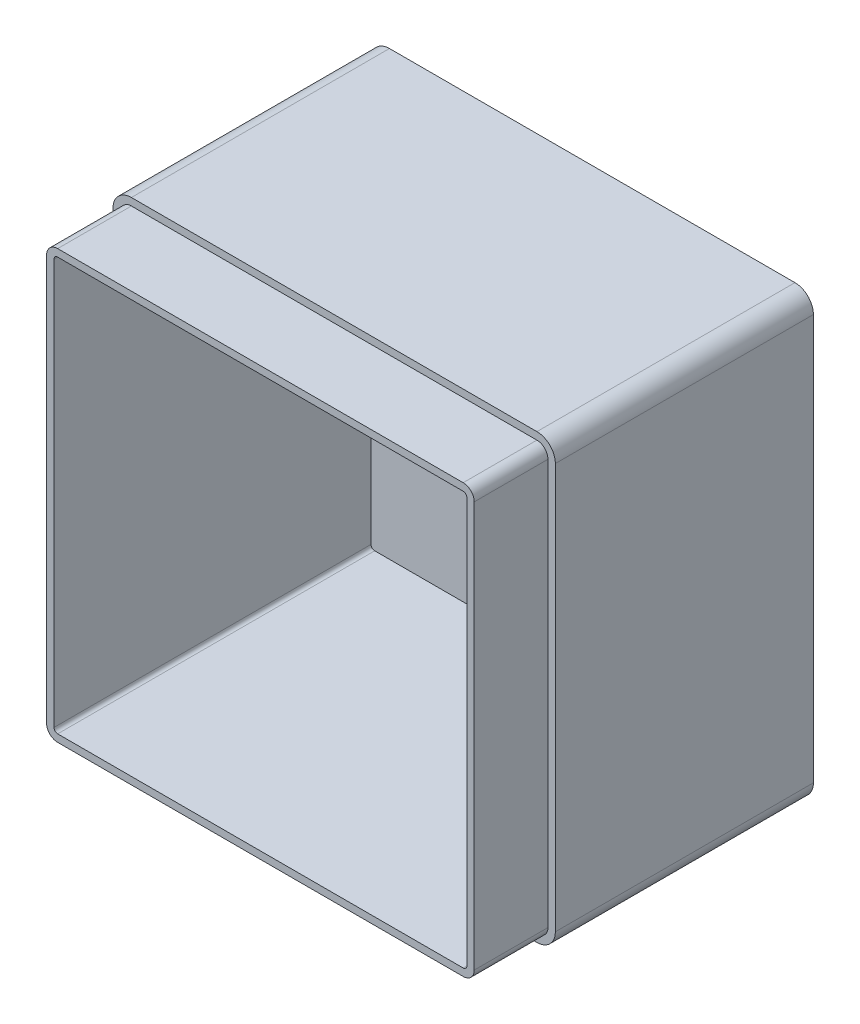
ISO-10303-21;
HEADER;
FILE_DESCRIPTION(('STEP AP214'),'2;1');
FILE_NAME('part.step','',(''),(''),'','','');
FILE_SCHEMA(('AUTOMOTIVE_DESIGN { 1 0 10303 214 1 1 1 1 }'));
ENDSEC;
DATA;
#1=APPLICATION_CONTEXT('core data for automotive mechanical design processes');
#2=APPLICATION_PROTOCOL_DEFINITION('international standard','automotive_design',2000,#1);
#3=PRODUCT_CONTEXT('',#1,'mechanical');
#4=PRODUCT('Part','Part','',(#3));
#5=PRODUCT_RELATED_PRODUCT_CATEGORY('part','',(#4));
#6=PRODUCT_DEFINITION_FORMATION('','',#4);
#7=PRODUCT_DEFINITION_CONTEXT('part definition',#1,'design');
#8=PRODUCT_DEFINITION('design','',#6,#7);
#9=PRODUCT_DEFINITION_SHAPE('','',#8);
#10=(LENGTH_UNIT() NAMED_UNIT(*) SI_UNIT(.MILLI.,.METRE.));
#11=(NAMED_UNIT(*) PLANE_ANGLE_UNIT() SI_UNIT($,.RADIAN.));
#12=(NAMED_UNIT(*) SI_UNIT($,.STERADIAN.) SOLID_ANGLE_UNIT());
#13=UNCERTAINTY_MEASURE_WITH_UNIT(LENGTH_MEASURE(1.E-05),#10,'distance_accuracy_value','');
#14=(GEOMETRIC_REPRESENTATION_CONTEXT(3) GLOBAL_UNCERTAINTY_ASSIGNED_CONTEXT((#13)) GLOBAL_UNIT_ASSIGNED_CONTEXT((#10,
#11,#12)) REPRESENTATION_CONTEXT('',''));
#15=CARTESIAN_POINT('',(0.,0.,0.));
#16=DIRECTION('',(0.,0.,1.));
#17=DIRECTION('',(1.,0.,0.));
#18=AXIS2_PLACEMENT_3D('',#15,#16,#17);
#19=CARTESIAN_POINT('',(0.,0.,90.));
#20=DIRECTION('',(0.,0.,-1.));
#21=DIRECTION('',(-1.,0.,0.));
#22=AXIS2_PLACEMENT_3D('',#19,#20,#21);
#23=PLANE('',#22);
#24=DIRECTION('',(0.,-1.,0.));
#25=VECTOR('',#24,1.);
#26=CARTESIAN_POINT('',(4.,0.,90.));
#27=LINE('',#26,#25);
#28=CARTESIAN_POINT('',(4.,115.,90.));
#29=VERTEX_POINT('',#28);
#30=CARTESIAN_POINT('',(4.,5.,90.));
#31=VERTEX_POINT('',#30);
#32=EDGE_CURVE('E304',#29,#31,#27,.T.);
#33=ORIENTED_EDGE('',*,*,#32,.F.);
#34=CARTESIAN_POINT('',(5.,115.,90.));
#35=DIRECTION('',(0.,0.,-1.));
#36=DIRECTION('',(-1.,0.,0.));
#37=AXIS2_PLACEMENT_3D('',#34,#35,#36);
#38=CIRCLE('',#37,1.);
#39=CARTESIAN_POINT('',(5.,116.,90.));
#40=VERTEX_POINT('',#39);
#41=EDGE_CURVE('E287',#40,#29,#38,.F.);
#42=ORIENTED_EDGE('',*,*,#41,.F.);
#43=DIRECTION('',(-1.,0.,0.));
#44=VECTOR('',#43,1.);
#45=CARTESIAN_POINT('',(0.,116.,90.));
#46=LINE('',#45,#44);
#47=CARTESIAN_POINT('',(115.,116.,90.));
#48=VERTEX_POINT('',#47);
#49=EDGE_CURVE('E313',#48,#40,#46,.T.);
#50=ORIENTED_EDGE('',*,*,#49,.F.);
#51=CARTESIAN_POINT('',(115.,115.,90.));
#52=DIRECTION('',(0.,0.,-1.));
#53=DIRECTION('',(-1.,0.,0.));
#54=AXIS2_PLACEMENT_3D('',#51,#52,#53);
#55=CIRCLE('',#54,1.);
#56=CARTESIAN_POINT('',(116.,115.,90.));
#57=VERTEX_POINT('',#56);
#58=EDGE_CURVE('E336',#57,#48,#55,.F.);
#59=ORIENTED_EDGE('',*,*,#58,.F.);
#60=DIRECTION('',(0.,1.,0.));
#61=VECTOR('',#60,1.);
#62=CARTESIAN_POINT('',(116.,0.,90.));
#63=LINE('',#62,#61);
#64=CARTESIAN_POINT('',(116.,5.,90.));
#65=VERTEX_POINT('',#64);
#66=EDGE_CURVE('E334',#65,#57,#63,.T.);
#67=ORIENTED_EDGE('',*,*,#66,.F.);
#68=CARTESIAN_POINT('',(115.,5.,90.));
#69=DIRECTION('',(0.,0.,-1.));
#70=DIRECTION('',(-1.,0.,0.));
#71=AXIS2_PLACEMENT_3D('',#68,#69,#70);
#72=CIRCLE('',#71,1.);
#73=CARTESIAN_POINT('',(115.,4.,90.));
#74=VERTEX_POINT('',#73);
#75=EDGE_CURVE('E331',#74,#65,#72,.F.);
#76=ORIENTED_EDGE('',*,*,#75,.F.);
#77=DIRECTION('',(1.,0.,0.));
#78=VECTOR('',#77,1.);
#79=CARTESIAN_POINT('',(0.,4.,90.));
#80=LINE('',#79,#78);
#81=CARTESIAN_POINT('',(5.,4.,90.));
#82=VERTEX_POINT('',#81);
#83=EDGE_CURVE('E329',#82,#74,#80,.T.);
#84=ORIENTED_EDGE('',*,*,#83,.F.);
#85=CARTESIAN_POINT('',(5.,5.,90.));
#86=DIRECTION('',(0.,0.,-1.));
#87=DIRECTION('',(-1.,0.,0.));
#88=AXIS2_PLACEMENT_3D('',#85,#86,#87);
#89=CIRCLE('',#88,1.);
#90=EDGE_CURVE('E320',#31,#82,#89,.F.);
#91=ORIENTED_EDGE('',*,*,#90,.F.);
#92=EDGE_LOOP('',(#33,#42,#50,#59,#67,#76,#84,#91));
#93=FACE_BOUND('',#92,.T.);
#94=CARTESIAN_POINT('',(5.,115.,90.));
#95=DIRECTION('',(0.,0.,1.));
#96=DIRECTION('',(1.,0.,0.));
#97=AXIS2_PLACEMENT_3D('',#94,#95,#96);
#98=CIRCLE('',#97,3.);
#99=CARTESIAN_POINT('',(5.,118.,90.));
#100=VERTEX_POINT('',#99);
#101=CARTESIAN_POINT('',(2.,115.,90.));
#102=VERTEX_POINT('',#101);
#103=EDGE_CURVE('E239',#100,#102,#98,.T.);
#104=ORIENTED_EDGE('',*,*,#103,.T.);
#105=DIRECTION('',(0.,-1.,0.));
#106=VECTOR('',#105,1.);
#107=CARTESIAN_POINT('',(2.,115.,90.));
#108=LINE('',#107,#106);
#109=CARTESIAN_POINT('',(2.,5.,90.));
#110=VERTEX_POINT('',#109);
#111=EDGE_CURVE('E199',#102,#110,#108,.T.);
#112=ORIENTED_EDGE('',*,*,#111,.T.);
#113=CARTESIAN_POINT('',(5.,5.,90.));
#114=DIRECTION('',(0.,0.,1.));
#115=DIRECTION('',(1.,0.,0.));
#116=AXIS2_PLACEMENT_3D('',#113,#114,#115);
#117=CIRCLE('',#116,3.);
#118=CARTESIAN_POINT('',(5.,2.,90.));
#119=VERTEX_POINT('',#118);
#120=EDGE_CURVE('E48',#110,#119,#117,.T.);
#121=ORIENTED_EDGE('',*,*,#120,.T.);
#122=DIRECTION('',(1.,0.,0.));
#123=VECTOR('',#122,1.);
#124=CARTESIAN_POINT('',(5.,2.,90.));
#125=LINE('',#124,#123);
#126=CARTESIAN_POINT('',(115.,2.,90.));
#127=VERTEX_POINT('',#126);
#128=EDGE_CURVE('E243',#119,#127,#125,.T.);
#129=ORIENTED_EDGE('',*,*,#128,.T.);
#130=CARTESIAN_POINT('',(115.,5.,90.));
#131=DIRECTION('',(0.,0.,1.));
#132=DIRECTION('',(1.,0.,0.));
#133=AXIS2_PLACEMENT_3D('',#130,#131,#132);
#134=CIRCLE('',#133,3.);
#135=CARTESIAN_POINT('',(118.,5.,90.));
#136=VERTEX_POINT('',#135);
#137=EDGE_CURVE('E246',#127,#136,#134,.T.);
#138=ORIENTED_EDGE('',*,*,#137,.T.);
#139=DIRECTION('',(0.,1.,0.));
#140=VECTOR('',#139,1.);
#141=CARTESIAN_POINT('',(118.,5.,90.));
#142=LINE('',#141,#140);
#143=CARTESIAN_POINT('',(118.,115.,90.));
#144=VERTEX_POINT('',#143);
#145=EDGE_CURVE('E249',#136,#144,#142,.T.);
#146=ORIENTED_EDGE('',*,*,#145,.T.);
#147=CARTESIAN_POINT('',(115.,115.,90.));
#148=DIRECTION('',(0.,0.,1.));
#149=DIRECTION('',(1.,0.,0.));
#150=AXIS2_PLACEMENT_3D('',#147,#148,#149);
#151=CIRCLE('',#150,3.);
#152=CARTESIAN_POINT('',(115.,118.,90.));
#153=VERTEX_POINT('',#152);
#154=EDGE_CURVE('E222',#144,#153,#151,.T.);
#155=ORIENTED_EDGE('',*,*,#154,.T.);
#156=DIRECTION('',(-1.,0.,0.));
#157=VECTOR('',#156,1.);
#158=CARTESIAN_POINT('',(115.,118.,90.));
#159=LINE('',#158,#157);
#160=EDGE_CURVE('E219',#153,#100,#159,.T.);
#161=ORIENTED_EDGE('',*,*,#160,.T.);
#162=EDGE_LOOP('',(#104,#112,#121,#129,#138,#146,#155,#161));
#163=FACE_BOUND('',#162,.T.);
#164=ADVANCED_FACE('F33',(#93,#163),#23,.F.);
#165=CARTESIAN_POINT('',(4.,0.,90.));
#166=DIRECTION('',(1.,0.,0.));
#167=DIRECTION('',(0.,0.,-1.));
#168=AXIS2_PLACEMENT_3D('',#165,#166,#167);
#169=PLANE('',#168);
#170=DIRECTION('',(0.,-1.,0.));
#171=VECTOR('',#170,1.);
#172=CARTESIAN_POINT('',(4.,0.,4.));
#173=LINE('',#172,#171);
#174=CARTESIAN_POINT('',(4.,115.,4.));
#175=VERTEX_POINT('',#174);
#176=CARTESIAN_POINT('',(4.,5.,4.));
#177=VERTEX_POINT('',#176);
#178=EDGE_CURVE('E281',#175,#177,#173,.T.);
#179=ORIENTED_EDGE('',*,*,#178,.F.);
#180=DIRECTION('',(0.,0.,-1.));
#181=VECTOR('',#180,1.);
#182=CARTESIAN_POINT('',(4.,115.,90.));
#183=LINE('',#182,#181);
#184=EDGE_CURVE('E288',#29,#175,#183,.T.);
#185=ORIENTED_EDGE('',*,*,#184,.F.);
#186=ORIENTED_EDGE('',*,*,#32,.T.);
#187=DIRECTION('',(0.,0.,-1.));
#188=VECTOR('',#187,1.);
#189=CARTESIAN_POINT('',(4.,5.,90.));
#190=LINE('',#189,#188);
#191=EDGE_CURVE('E285',#177,#31,#190,.F.);
#192=ORIENTED_EDGE('',*,*,#191,.F.);
#193=EDGE_LOOP('',(#179,#185,#186,#192));
#194=FACE_BOUND('',#193,.T.);
#195=ADVANCED_FACE('F426',(#194),#169,.T.);
#196=CARTESIAN_POINT('',(0.,4.,90.));
#197=DIRECTION('',(0.,1.,0.));
#198=DIRECTION('',(0.,0.,1.));
#199=AXIS2_PLACEMENT_3D('',#196,#197,#198);
#200=PLANE('',#199);
#201=ORIENTED_EDGE('',*,*,#83,.T.);
#202=DIRECTION('',(0.,0.,1.));
#203=VECTOR('',#202,1.);
#204=CARTESIAN_POINT('',(115.,4.,90.));
#205=LINE('',#204,#203);
#206=CARTESIAN_POINT('',(115.,4.,4.));
#207=VERTEX_POINT('',#206);
#208=EDGE_CURVE('E311',#207,#74,#205,.T.);
#209=ORIENTED_EDGE('',*,*,#208,.F.);
#210=DIRECTION('',(1.,0.,0.));
#211=VECTOR('',#210,1.);
#212=CARTESIAN_POINT('',(0.,4.,4.));
#213=LINE('',#212,#211);
#214=CARTESIAN_POINT('',(5.,4.,4.));
#215=VERTEX_POINT('',#214);
#216=EDGE_CURVE('E284',#215,#207,#213,.T.);
#217=ORIENTED_EDGE('',*,*,#216,.F.);
#218=DIRECTION('',(0.,0.,1.));
#219=VECTOR('',#218,1.);
#220=CARTESIAN_POINT('',(5.,4.,90.));
#221=LINE('',#220,#219);
#222=EDGE_CURVE('E300',#82,#215,#221,.F.);
#223=ORIENTED_EDGE('',*,*,#222,.F.);
#224=EDGE_LOOP('',(#201,#209,#217,#223));
#225=FACE_BOUND('',#224,.T.);
#226=ADVANCED_FACE('F431',(#225),#200,.T.);
#227=CARTESIAN_POINT('',(116.,0.,90.));
#228=DIRECTION('',(-1.,0.,0.));
#229=DIRECTION('',(0.,0.,1.));
#230=AXIS2_PLACEMENT_3D('',#227,#228,#229);
#231=PLANE('',#230);
#232=ORIENTED_EDGE('',*,*,#66,.T.);
#233=DIRECTION('',(0.,0.,1.));
#234=VECTOR('',#233,1.);
#235=CARTESIAN_POINT('',(116.,115.,90.));
#236=LINE('',#235,#234);
#237=CARTESIAN_POINT('',(116.,115.,4.));
#238=VERTEX_POINT('',#237);
#239=EDGE_CURVE('E318',#238,#57,#236,.T.);
#240=ORIENTED_EDGE('',*,*,#239,.F.);
#241=DIRECTION('',(0.,1.,0.));
#242=VECTOR('',#241,1.);
#243=CARTESIAN_POINT('',(116.,0.,4.));
#244=LINE('',#243,#242);
#245=CARTESIAN_POINT('',(116.,5.,4.));
#246=VERTEX_POINT('',#245);
#247=EDGE_CURVE('E294',#246,#238,#244,.T.);
#248=ORIENTED_EDGE('',*,*,#247,.F.);
#249=DIRECTION('',(0.,0.,1.));
#250=VECTOR('',#249,1.);
#251=CARTESIAN_POINT('',(116.,5.,90.));
#252=LINE('',#251,#250);
#253=EDGE_CURVE('E314',#65,#246,#252,.F.);
#254=ORIENTED_EDGE('',*,*,#253,.F.);
#255=EDGE_LOOP('',(#232,#240,#248,#254));
#256=FACE_BOUND('',#255,.T.);
#257=ADVANCED_FACE('F460',(#256),#231,.T.);
#258=CARTESIAN_POINT('',(0.,116.,90.));
#259=DIRECTION('',(0.,-1.,0.));
#260=DIRECTION('',(0.,0.,-1.));
#261=AXIS2_PLACEMENT_3D('',#258,#259,#260);
#262=PLANE('',#261);
#263=ORIENTED_EDGE('',*,*,#49,.T.);
#264=DIRECTION('',(0.,0.,-1.));
#265=VECTOR('',#264,1.);
#266=CARTESIAN_POINT('',(5.,116.,90.));
#267=LINE('',#266,#265);
#268=CARTESIAN_POINT('',(5.,116.,4.));
#269=VERTEX_POINT('',#268);
#270=EDGE_CURVE('E317',#269,#40,#267,.F.);
#271=ORIENTED_EDGE('',*,*,#270,.F.);
#272=DIRECTION('',(-1.,0.,0.));
#273=VECTOR('',#272,1.);
#274=CARTESIAN_POINT('',(0.,116.,4.));
#275=LINE('',#274,#273);
#276=CARTESIAN_POINT('',(115.,116.,4.));
#277=VERTEX_POINT('',#276);
#278=EDGE_CURVE('E301',#277,#269,#275,.T.);
#279=ORIENTED_EDGE('',*,*,#278,.F.);
#280=DIRECTION('',(0.,0.,-1.));
#281=VECTOR('',#280,1.);
#282=CARTESIAN_POINT('',(115.,116.,90.));
#283=LINE('',#282,#281);
#284=EDGE_CURVE('E321',#48,#277,#283,.T.);
#285=ORIENTED_EDGE('',*,*,#284,.F.);
#286=EDGE_LOOP('',(#263,#271,#279,#285));
#287=FACE_BOUND('',#286,.T.);
#288=ADVANCED_FACE('F456',(#287),#262,.T.);
#289=CARTESIAN_POINT('',(0.,0.,4.));
#290=DIRECTION('',(0.,0.,-1.));
#291=DIRECTION('',(-1.,0.,0.));
#292=AXIS2_PLACEMENT_3D('',#289,#290,#291);
#293=PLANE('',#292);
#294=ORIENTED_EDGE('',*,*,#216,.T.);
#295=CARTESIAN_POINT('',(115.,5.,4.));
#296=DIRECTION('',(0.,0.,-1.));
#297=DIRECTION('',(-1.,0.,0.));
#298=AXIS2_PLACEMENT_3D('',#295,#296,#297);
#299=CIRCLE('',#298,1.);
#300=EDGE_CURVE('E296',#246,#207,#299,.T.);
#301=ORIENTED_EDGE('',*,*,#300,.F.);
#302=ORIENTED_EDGE('',*,*,#247,.T.);
#303=CARTESIAN_POINT('',(115.,115.,4.));
#304=DIRECTION('',(0.,0.,-1.));
#305=DIRECTION('',(-1.,0.,0.));
#306=AXIS2_PLACEMENT_3D('',#303,#304,#305);
#307=CIRCLE('',#306,1.);
#308=EDGE_CURVE('E299',#277,#238,#307,.T.);
#309=ORIENTED_EDGE('',*,*,#308,.F.);
#310=ORIENTED_EDGE('',*,*,#278,.T.);
#311=CARTESIAN_POINT('',(5.,115.,4.));
#312=DIRECTION('',(0.,0.,-1.));
#313=DIRECTION('',(-1.,0.,0.));
#314=AXIS2_PLACEMENT_3D('',#311,#312,#313);
#315=CIRCLE('',#314,1.);
#316=EDGE_CURVE('E297',#175,#269,#315,.T.);
#317=ORIENTED_EDGE('',*,*,#316,.F.);
#318=ORIENTED_EDGE('',*,*,#178,.T.);
#319=CARTESIAN_POINT('',(5.,5.,4.));
#320=DIRECTION('',(0.,0.,-1.));
#321=DIRECTION('',(-1.,0.,0.));
#322=AXIS2_PLACEMENT_3D('',#319,#320,#321);
#323=CIRCLE('',#322,1.);
#324=EDGE_CURVE('E291',#215,#177,#323,.T.);
#325=ORIENTED_EDGE('',*,*,#324,.F.);
#326=EDGE_LOOP('',(#294,#301,#302,#309,#310,#317,#318,#325));
#327=FACE_BOUND('',#326,.T.);
#328=ADVANCED_FACE('F452',(#327),#293,.F.);
#329=CARTESIAN_POINT('',(5.,5.,90.));
#330=DIRECTION('',(0.,0.,-1.));
#331=DIRECTION('',(-1.,0.,0.));
#332=AXIS2_PLACEMENT_3D('',#329,#330,#331);
#333=CYLINDRICAL_SURFACE('',#332,1.);
#334=ORIENTED_EDGE('',*,*,#90,.T.);
#335=ORIENTED_EDGE('',*,*,#222,.T.);
#336=ORIENTED_EDGE('',*,*,#324,.T.);
#337=ORIENTED_EDGE('',*,*,#191,.T.);
#338=EDGE_LOOP('',(#334,#335,#336,#337));
#339=FACE_BOUND('',#338,.T.);
#340=ADVANCED_FACE('F448',(#339),#333,.F.);
#341=CARTESIAN_POINT('',(115.,5.,90.));
#342=DIRECTION('',(0.,0.,-1.));
#343=DIRECTION('',(-1.,0.,0.));
#344=AXIS2_PLACEMENT_3D('',#341,#342,#343);
#345=CYLINDRICAL_SURFACE('',#344,1.);
#346=ORIENTED_EDGE('',*,*,#75,.T.);
#347=ORIENTED_EDGE('',*,*,#253,.T.);
#348=ORIENTED_EDGE('',*,*,#300,.T.);
#349=ORIENTED_EDGE('',*,*,#208,.T.);
#350=EDGE_LOOP('',(#346,#347,#348,#349));
#351=FACE_BOUND('',#350,.T.);
#352=ADVANCED_FACE('F444',(#351),#345,.F.);
#353=CARTESIAN_POINT('',(115.,115.,90.));
#354=DIRECTION('',(0.,0.,-1.));
#355=DIRECTION('',(-1.,0.,0.));
#356=AXIS2_PLACEMENT_3D('',#353,#354,#355);
#357=CYLINDRICAL_SURFACE('',#356,1.);
#358=ORIENTED_EDGE('',*,*,#58,.T.);
#359=ORIENTED_EDGE('',*,*,#284,.T.);
#360=ORIENTED_EDGE('',*,*,#308,.T.);
#361=ORIENTED_EDGE('',*,*,#239,.T.);
#362=EDGE_LOOP('',(#358,#359,#360,#361));
#363=FACE_BOUND('',#362,.T.);
#364=ADVANCED_FACE('F440',(#363),#357,.F.);
#365=CARTESIAN_POINT('',(5.,115.,90.));
#366=DIRECTION('',(0.,0.,-1.));
#367=DIRECTION('',(-1.,0.,0.));
#368=AXIS2_PLACEMENT_3D('',#365,#366,#367);
#369=CYLINDRICAL_SURFACE('',#368,1.);
#370=ORIENTED_EDGE('',*,*,#41,.T.);
#371=ORIENTED_EDGE('',*,*,#184,.T.);
#372=ORIENTED_EDGE('',*,*,#316,.T.);
#373=ORIENTED_EDGE('',*,*,#270,.T.);
#374=EDGE_LOOP('',(#370,#371,#372,#373));
#375=FACE_BOUND('',#374,.T.);
#376=ADVANCED_FACE('F437',(#375),#369,.F.);
#377=CARTESIAN_POINT('',(5.,115.,70.));
#378=DIRECTION('',(0.,0.,1.));
#379=DIRECTION('',(1.,0.,0.));
#380=AXIS2_PLACEMENT_3D('',#377,#378,#379);
#381=PLANE('',#380);
#382=DIRECTION('',(-1.,0.,0.));
#383=VECTOR('',#382,1.);
#384=CARTESIAN_POINT('',(115.,118.,70.));
#385=LINE('',#384,#383);
#386=CARTESIAN_POINT('',(115.,118.,70.));
#387=VERTEX_POINT('',#386);
#388=CARTESIAN_POINT('',(5.,118.,70.));
#389=VERTEX_POINT('',#388);
#390=EDGE_CURVE('E205',#387,#389,#385,.T.);
#391=ORIENTED_EDGE('',*,*,#390,.F.);
#392=CARTESIAN_POINT('',(115.,115.,70.));
#393=DIRECTION('',(0.,0.,1.));
#394=DIRECTION('',(1.,0.,0.));
#395=AXIS2_PLACEMENT_3D('',#392,#393,#394);
#396=CIRCLE('',#395,3.);
#397=CARTESIAN_POINT('',(118.,115.,70.));
#398=VERTEX_POINT('',#397);
#399=EDGE_CURVE('E235',#398,#387,#396,.T.);
#400=ORIENTED_EDGE('',*,*,#399,.F.);
#401=DIRECTION('',(0.,1.,0.));
#402=VECTOR('',#401,1.);
#403=CARTESIAN_POINT('',(118.,5.,70.));
#404=LINE('',#403,#402);
#405=CARTESIAN_POINT('',(118.,5.,70.));
#406=VERTEX_POINT('',#405);
#407=EDGE_CURVE('E232',#406,#398,#404,.T.);
#408=ORIENTED_EDGE('',*,*,#407,.F.);
#409=CARTESIAN_POINT('',(115.,5.,70.));
#410=DIRECTION('',(0.,0.,1.));
#411=DIRECTION('',(1.,0.,0.));
#412=AXIS2_PLACEMENT_3D('',#409,#410,#411);
#413=CIRCLE('',#412,3.);
#414=CARTESIAN_POINT('',(115.,2.,70.));
#415=VERTEX_POINT('',#414);
#416=EDGE_CURVE('E229',#415,#406,#413,.T.);
#417=ORIENTED_EDGE('',*,*,#416,.F.);
#418=DIRECTION('',(1.,0.,0.));
#419=VECTOR('',#418,1.);
#420=CARTESIAN_POINT('',(5.,2.,70.));
#421=LINE('',#420,#419);
#422=CARTESIAN_POINT('',(5.,2.,70.));
#423=VERTEX_POINT('',#422);
#424=EDGE_CURVE('E226',#423,#415,#421,.T.);
#425=ORIENTED_EDGE('',*,*,#424,.F.);
#426=CARTESIAN_POINT('',(5.,5.,70.));
#427=DIRECTION('',(0.,0.,1.));
#428=DIRECTION('',(1.,0.,0.));
#429=AXIS2_PLACEMENT_3D('',#426,#427,#428);
#430=CIRCLE('',#429,3.);
#431=CARTESIAN_POINT('',(2.,5.,70.));
#432=VERTEX_POINT('',#431);
#433=EDGE_CURVE('E215',#432,#423,#430,.T.);
#434=ORIENTED_EDGE('',*,*,#433,.F.);
#435=DIRECTION('',(0.,-1.,0.));
#436=VECTOR('',#435,1.);
#437=CARTESIAN_POINT('',(2.,115.,70.));
#438=LINE('',#437,#436);
#439=CARTESIAN_POINT('',(2.,115.,70.));
#440=VERTEX_POINT('',#439);
#441=EDGE_CURVE('E197',#440,#432,#438,.T.);
#442=ORIENTED_EDGE('',*,*,#441,.F.);
#443=CARTESIAN_POINT('',(5.,115.,70.));
#444=DIRECTION('',(0.,0.,1.));
#445=DIRECTION('',(1.,0.,0.));
#446=AXIS2_PLACEMENT_3D('',#443,#444,#445);
#447=CIRCLE('',#446,3.);
#448=EDGE_CURVE('E211',#389,#440,#447,.T.);
#449=ORIENTED_EDGE('',*,*,#448,.F.);
#450=EDGE_LOOP('',(#391,#400,#408,#417,#425,#434,#442,#449));
#451=FACE_BOUND('',#450,.T.);
#452=CARTESIAN_POINT('',(5.,115.,70.));
#453=DIRECTION('',(0.,0.,1.));
#454=DIRECTION('',(1.,0.,0.));
#455=AXIS2_PLACEMENT_3D('',#452,#453,#454);
#456=CIRCLE('',#455,5.);
#457=CARTESIAN_POINT('',(5.,120.,70.));
#458=VERTEX_POINT('',#457);
#459=CARTESIAN_POINT('',(0.,115.,70.));
#460=VERTEX_POINT('',#459);
#461=EDGE_CURVE('E255',#458,#460,#456,.T.);
#462=ORIENTED_EDGE('',*,*,#461,.T.);
#463=DIRECTION('',(0.,-1.,0.));
#464=VECTOR('',#463,1.);
#465=CARTESIAN_POINT('',(0.,115.,70.));
#466=LINE('',#465,#464);
#467=CARTESIAN_POINT('',(0.,5.,70.));
#468=VERTEX_POINT('',#467);
#469=EDGE_CURVE('E268',#460,#468,#466,.T.);
#470=ORIENTED_EDGE('',*,*,#469,.T.);
#471=CARTESIAN_POINT('',(5.,5.,70.));
#472=DIRECTION('',(0.,0.,1.));
#473=DIRECTION('',(1.,0.,0.));
#474=AXIS2_PLACEMENT_3D('',#471,#472,#473);
#475=CIRCLE('',#474,5.);
#476=CARTESIAN_POINT('',(5.,0.,70.));
#477=VERTEX_POINT('',#476);
#478=EDGE_CURVE('E270',#468,#477,#475,.T.);
#479=ORIENTED_EDGE('',*,*,#478,.T.);
#480=DIRECTION('',(1.,0.,0.));
#481=VECTOR('',#480,1.);
#482=CARTESIAN_POINT('',(5.,0.,70.));
#483=LINE('',#482,#481);
#484=CARTESIAN_POINT('',(115.,0.,70.));
#485=VERTEX_POINT('',#484);
#486=EDGE_CURVE('E272',#477,#485,#483,.T.);
#487=ORIENTED_EDGE('',*,*,#486,.T.);
#488=CARTESIAN_POINT('',(115.,5.,70.));
#489=DIRECTION('',(0.,0.,1.));
#490=DIRECTION('',(1.,0.,0.));
#491=AXIS2_PLACEMENT_3D('',#488,#489,#490);
#492=CIRCLE('',#491,5.);
#493=CARTESIAN_POINT('',(120.,5.,70.));
#494=VERTEX_POINT('',#493);
#495=EDGE_CURVE('E274',#485,#494,#492,.T.);
#496=ORIENTED_EDGE('',*,*,#495,.T.);
#497=DIRECTION('',(0.,1.,0.));
#498=VECTOR('',#497,1.);
#499=CARTESIAN_POINT('',(120.,5.,70.));
#500=LINE('',#499,#498);
#501=CARTESIAN_POINT('',(120.,115.,70.));
#502=VERTEX_POINT('',#501);
#503=EDGE_CURVE('E276',#494,#502,#500,.T.);
#504=ORIENTED_EDGE('',*,*,#503,.T.);
#505=CARTESIAN_POINT('',(115.,115.,70.));
#506=DIRECTION('',(0.,0.,1.));
#507=DIRECTION('',(1.,0.,0.));
#508=AXIS2_PLACEMENT_3D('',#505,#506,#507);
#509=CIRCLE('',#508,5.);
#510=CARTESIAN_POINT('',(115.,120.,70.));
#511=VERTEX_POINT('',#510);
#512=EDGE_CURVE('E278',#502,#511,#509,.T.);
#513=ORIENTED_EDGE('',*,*,#512,.T.);
#514=DIRECTION('',(-1.,0.,0.));
#515=VECTOR('',#514,1.);
#516=CARTESIAN_POINT('',(115.,120.,70.));
#517=LINE('',#516,#515);
#518=EDGE_CURVE('E56',#511,#458,#517,.T.);
#519=ORIENTED_EDGE('',*,*,#518,.T.);
#520=EDGE_LOOP('',(#462,#470,#479,#487,#496,#504,#513,#519));
#521=FACE_BOUND('',#520,.T.);
#522=ADVANCED_FACE('F210',(#451,#521),#381,.T.);
#523=CARTESIAN_POINT('',(5.,115.,70.));
#524=DIRECTION('',(0.,0.,1.));
#525=DIRECTION('',(1.,0.,0.));
#526=AXIS2_PLACEMENT_3D('',#523,#524,#525);
#527=CYLINDRICAL_SURFACE('',#526,3.);
#528=ORIENTED_EDGE('',*,*,#103,.F.);
#529=DIRECTION('',(0.,0.,1.));
#530=VECTOR('',#529,1.);
#531=CARTESIAN_POINT('',(5.,118.,70.));
#532=LINE('',#531,#530);
#533=EDGE_CURVE('E218',#389,#100,#532,.T.);
#534=ORIENTED_EDGE('',*,*,#533,.F.);
#535=ORIENTED_EDGE('',*,*,#448,.T.);
#536=DIRECTION('',(0.,0.,1.));
#537=VECTOR('',#536,1.);
#538=CARTESIAN_POINT('',(2.,115.,70.));
#539=LINE('',#538,#537);
#540=EDGE_CURVE('E194',#440,#102,#539,.T.);
#541=ORIENTED_EDGE('',*,*,#540,.T.);
#542=EDGE_LOOP('',(#528,#534,#535,#541));
#543=FACE_BOUND('',#542,.T.);
#544=ADVANCED_FACE('F217',(#543),#527,.T.);
#545=CARTESIAN_POINT('',(115.,118.,70.));
#546=DIRECTION('',(0.,1.,0.));
#547=DIRECTION('',(0.,0.,1.));
#548=AXIS2_PLACEMENT_3D('',#545,#546,#547);
#549=PLANE('',#548);
#550=ORIENTED_EDGE('',*,*,#160,.F.);
#551=DIRECTION('',(0.,0.,1.));
#552=VECTOR('',#551,1.);
#553=CARTESIAN_POINT('',(115.,118.,70.));
#554=LINE('',#553,#552);
#555=EDGE_CURVE('E256',#387,#153,#554,.T.);
#556=ORIENTED_EDGE('',*,*,#555,.F.);
#557=ORIENTED_EDGE('',*,*,#390,.T.);
#558=ORIENTED_EDGE('',*,*,#533,.T.);
#559=EDGE_LOOP('',(#550,#556,#557,#558));
#560=FACE_BOUND('',#559,.T.);
#561=ADVANCED_FACE('F471',(#560),#549,.T.);
#562=CARTESIAN_POINT('',(115.,115.,70.));
#563=DIRECTION('',(0.,0.,1.));
#564=DIRECTION('',(1.,0.,0.));
#565=AXIS2_PLACEMENT_3D('',#562,#563,#564);
#566=CYLINDRICAL_SURFACE('',#565,3.);
#567=ORIENTED_EDGE('',*,*,#154,.F.);
#568=DIRECTION('',(0.,0.,1.));
#569=VECTOR('',#568,1.);
#570=CARTESIAN_POINT('',(118.,115.,70.));
#571=LINE('',#570,#569);
#572=EDGE_CURVE('E258',#398,#144,#571,.T.);
#573=ORIENTED_EDGE('',*,*,#572,.F.);
#574=ORIENTED_EDGE('',*,*,#399,.T.);
#575=ORIENTED_EDGE('',*,*,#555,.T.);
#576=EDGE_LOOP('',(#567,#573,#574,#575));
#577=FACE_BOUND('',#576,.T.);
#578=ADVANCED_FACE('F486',(#577),#566,.T.);
#579=CARTESIAN_POINT('',(118.,5.,70.));
#580=DIRECTION('',(1.,0.,0.));
#581=DIRECTION('',(0.,0.,-1.));
#582=AXIS2_PLACEMENT_3D('',#579,#580,#581);
#583=PLANE('',#582);
#584=ORIENTED_EDGE('',*,*,#145,.F.);
#585=DIRECTION('',(0.,0.,1.));
#586=VECTOR('',#585,1.);
#587=CARTESIAN_POINT('',(118.,5.,70.));
#588=LINE('',#587,#586);
#589=EDGE_CURVE('E260',#406,#136,#588,.T.);
#590=ORIENTED_EDGE('',*,*,#589,.F.);
#591=ORIENTED_EDGE('',*,*,#407,.T.);
#592=ORIENTED_EDGE('',*,*,#572,.T.);
#593=EDGE_LOOP('',(#584,#590,#591,#592));
#594=FACE_BOUND('',#593,.T.);
#595=ADVANCED_FACE('F482',(#594),#583,.T.);
#596=CARTESIAN_POINT('',(115.,5.,70.));
#597=DIRECTION('',(0.,0.,1.));
#598=DIRECTION('',(1.,0.,0.));
#599=AXIS2_PLACEMENT_3D('',#596,#597,#598);
#600=CYLINDRICAL_SURFACE('',#599,3.);
#601=ORIENTED_EDGE('',*,*,#137,.F.);
#602=DIRECTION('',(0.,0.,1.));
#603=VECTOR('',#602,1.);
#604=CARTESIAN_POINT('',(115.,2.,70.));
#605=LINE('',#604,#603);
#606=EDGE_CURVE('E262',#415,#127,#605,.T.);
#607=ORIENTED_EDGE('',*,*,#606,.F.);
#608=ORIENTED_EDGE('',*,*,#416,.T.);
#609=ORIENTED_EDGE('',*,*,#589,.T.);
#610=EDGE_LOOP('',(#601,#607,#608,#609));
#611=FACE_BOUND('',#610,.T.);
#612=ADVANCED_FACE('F478',(#611),#600,.T.);
#613=CARTESIAN_POINT('',(5.,2.,70.));
#614=DIRECTION('',(0.,-1.,0.));
#615=DIRECTION('',(0.,0.,-1.));
#616=AXIS2_PLACEMENT_3D('',#613,#614,#615);
#617=PLANE('',#616);
#618=ORIENTED_EDGE('',*,*,#128,.F.);
#619=DIRECTION('',(0.,0.,1.));
#620=VECTOR('',#619,1.);
#621=CARTESIAN_POINT('',(5.,2.,70.));
#622=LINE('',#621,#620);
#623=EDGE_CURVE('E264',#423,#119,#622,.T.);
#624=ORIENTED_EDGE('',*,*,#623,.F.);
#625=ORIENTED_EDGE('',*,*,#424,.T.);
#626=ORIENTED_EDGE('',*,*,#606,.T.);
#627=EDGE_LOOP('',(#618,#624,#625,#626));
#628=FACE_BOUND('',#627,.T.);
#629=ADVANCED_FACE('F475',(#628),#617,.T.);
#630=CARTESIAN_POINT('',(5.,5.,70.));
#631=DIRECTION('',(0.,0.,1.));
#632=DIRECTION('',(1.,0.,0.));
#633=AXIS2_PLACEMENT_3D('',#630,#631,#632);
#634=CYLINDRICAL_SURFACE('',#633,3.);
#635=ORIENTED_EDGE('',*,*,#120,.F.);
#636=DIRECTION('',(0.,0.,1.));
#637=VECTOR('',#636,1.);
#638=CARTESIAN_POINT('',(2.,5.,70.));
#639=LINE('',#638,#637);
#640=EDGE_CURVE('E204',#432,#110,#639,.T.);
#641=ORIENTED_EDGE('',*,*,#640,.F.);
#642=ORIENTED_EDGE('',*,*,#433,.T.);
#643=ORIENTED_EDGE('',*,*,#623,.T.);
#644=EDGE_LOOP('',(#635,#641,#642,#643));
#645=FACE_BOUND('',#644,.T.);
#646=ADVANCED_FACE('F421',(#645),#634,.T.);
#647=CARTESIAN_POINT('',(2.,115.,70.));
#648=DIRECTION('',(-1.,0.,0.));
#649=DIRECTION('',(0.,0.,1.));
#650=AXIS2_PLACEMENT_3D('',#647,#648,#649);
#651=PLANE('',#650);
#652=ORIENTED_EDGE('',*,*,#111,.F.);
#653=ORIENTED_EDGE('',*,*,#540,.F.);
#654=ORIENTED_EDGE('',*,*,#441,.T.);
#655=ORIENTED_EDGE('',*,*,#640,.T.);
#656=EDGE_LOOP('',(#652,#653,#654,#655));
#657=FACE_BOUND('',#656,.T.);
#658=ADVANCED_FACE('F196',(#657),#651,.T.);
#659=CARTESIAN_POINT('',(0.,0.,0.));
#660=DIRECTION('',(0.,0.,-1.));
#661=DIRECTION('',(-1.,0.,0.));
#662=AXIS2_PLACEMENT_3D('',#659,#660,#661);
#663=PLANE('',#662);
#664=DIRECTION('',(1.,0.,0.));
#665=VECTOR('',#664,1.);
#666=CARTESIAN_POINT('',(0.,0.,0.));
#667=LINE('',#666,#665);
#668=CARTESIAN_POINT('',(5.,0.,0.));
#669=VERTEX_POINT('',#668);
#670=CARTESIAN_POINT('',(115.,0.,0.));
#671=VERTEX_POINT('',#670);
#672=EDGE_CURVE('E344',#669,#671,#667,.T.);
#673=ORIENTED_EDGE('',*,*,#672,.F.);
#674=CARTESIAN_POINT('',(5.,5.,0.));
#675=DIRECTION('',(0.,0.,-1.));
#676=DIRECTION('',(-1.,0.,0.));
#677=AXIS2_PLACEMENT_3D('',#674,#675,#676);
#678=CIRCLE('',#677,5.);
#679=CARTESIAN_POINT('',(0.,5.,0.));
#680=VERTEX_POINT('',#679);
#681=EDGE_CURVE('E364',#669,#680,#678,.T.);
#682=ORIENTED_EDGE('',*,*,#681,.T.);
#683=DIRECTION('',(0.,-1.,0.));
#684=VECTOR('',#683,1.);
#685=CARTESIAN_POINT('',(0.,0.,0.));
#686=LINE('',#685,#684);
#687=CARTESIAN_POINT('',(0.,115.,0.));
#688=VERTEX_POINT('',#687);
#689=EDGE_CURVE('E324',#688,#680,#686,.T.);
#690=ORIENTED_EDGE('',*,*,#689,.F.);
#691=CARTESIAN_POINT('',(5.,115.,0.));
#692=DIRECTION('',(0.,0.,-1.));
#693=DIRECTION('',(-1.,0.,0.));
#694=AXIS2_PLACEMENT_3D('',#691,#692,#693);
#695=CIRCLE('',#694,5.);
#696=CARTESIAN_POINT('',(5.,120.,0.));
#697=VERTEX_POINT('',#696);
#698=EDGE_CURVE('E358',#688,#697,#695,.T.);
#699=ORIENTED_EDGE('',*,*,#698,.T.);
#700=DIRECTION('',(-1.,0.,0.));
#701=VECTOR('',#700,1.);
#702=CARTESIAN_POINT('',(0.,120.,0.));
#703=LINE('',#702,#701);
#704=CARTESIAN_POINT('',(115.,120.,0.));
#705=VERTEX_POINT('',#704);
#706=EDGE_CURVE('E350',#705,#697,#703,.T.);
#707=ORIENTED_EDGE('',*,*,#706,.F.);
#708=CARTESIAN_POINT('',(115.,115.,0.));
#709=DIRECTION('',(0.,0.,-1.));
#710=DIRECTION('',(-1.,0.,0.));
#711=AXIS2_PLACEMENT_3D('',#708,#709,#710);
#712=CIRCLE('',#711,5.);
#713=CARTESIAN_POINT('',(120.,115.,0.));
#714=VERTEX_POINT('',#713);
#715=EDGE_CURVE('E360',#705,#714,#712,.T.);
#716=ORIENTED_EDGE('',*,*,#715,.T.);
#717=DIRECTION('',(0.,1.,0.));
#718=VECTOR('',#717,1.);
#719=CARTESIAN_POINT('',(120.,0.,0.));
#720=LINE('',#719,#718);
#721=CARTESIAN_POINT('',(120.,5.,0.));
#722=VERTEX_POINT('',#721);
#723=EDGE_CURVE('E347',#722,#714,#720,.T.);
#724=ORIENTED_EDGE('',*,*,#723,.F.);
#725=CARTESIAN_POINT('',(115.,5.,0.));
#726=DIRECTION('',(0.,0.,-1.));
#727=DIRECTION('',(-1.,0.,0.));
#728=AXIS2_PLACEMENT_3D('',#725,#726,#727);
#729=CIRCLE('',#728,5.);
#730=EDGE_CURVE('E362',#722,#671,#729,.T.);
#731=ORIENTED_EDGE('',*,*,#730,.T.);
#732=EDGE_LOOP('',(#673,#682,#690,#699,#707,#716,#724,#731));
#733=FACE_BOUND('',#732,.T.);
#734=ADVANCED_FACE('F414',(#733),#663,.T.);
#735=CARTESIAN_POINT('',(5.,115.,90.));
#736=DIRECTION('',(0.,0.,-1.));
#737=DIRECTION('',(-1.,0.,0.));
#738=AXIS2_PLACEMENT_3D('',#735,#736,#737);
#739=CYLINDRICAL_SURFACE('',#738,5.);
#740=DIRECTION('',(0.,0.,-1.));
#741=VECTOR('',#740,1.);
#742=CARTESIAN_POINT('',(0.,115.,90.));
#743=LINE('',#742,#741);
#744=EDGE_CURVE('E366',#460,#688,#743,.T.);
#745=ORIENTED_EDGE('',*,*,#744,.F.);
#746=ORIENTED_EDGE('',*,*,#461,.F.);
#747=DIRECTION('',(0.,0.,-1.));
#748=VECTOR('',#747,1.);
#749=CARTESIAN_POINT('',(5.,120.,90.));
#750=LINE('',#749,#748);
#751=EDGE_CURVE('E41',#697,#458,#750,.F.);
#752=ORIENTED_EDGE('',*,*,#751,.F.);
#753=ORIENTED_EDGE('',*,*,#698,.F.);
#754=EDGE_LOOP('',(#745,#746,#752,#753));
#755=FACE_BOUND('',#754,.T.);
#756=ADVANCED_FACE('F35',(#755),#739,.T.);
#757=CARTESIAN_POINT('',(115.,115.,90.));
#758=DIRECTION('',(0.,0.,-1.));
#759=DIRECTION('',(-1.,0.,0.));
#760=AXIS2_PLACEMENT_3D('',#757,#758,#759);
#761=CYLINDRICAL_SURFACE('',#760,5.);
#762=DIRECTION('',(0.,0.,-1.));
#763=VECTOR('',#762,1.);
#764=CARTESIAN_POINT('',(115.,120.,90.));
#765=LINE('',#764,#763);
#766=EDGE_CURVE('E11',#511,#705,#765,.T.);
#767=ORIENTED_EDGE('',*,*,#766,.F.);
#768=ORIENTED_EDGE('',*,*,#512,.F.);
#769=DIRECTION('',(0.,0.,-1.));
#770=VECTOR('',#769,1.);
#771=CARTESIAN_POINT('',(120.,115.,90.));
#772=LINE('',#771,#770);
#773=EDGE_CURVE('E371',#714,#502,#772,.F.);
#774=ORIENTED_EDGE('',*,*,#773,.F.);
#775=ORIENTED_EDGE('',*,*,#715,.F.);
#776=EDGE_LOOP('',(#767,#768,#774,#775));
#777=FACE_BOUND('',#776,.T.);
#778=ADVANCED_FACE('F412',(#777),#761,.T.);
#779=CARTESIAN_POINT('',(0.,120.,90.));
#780=DIRECTION('',(0.,-1.,0.));
#781=DIRECTION('',(0.,0.,-1.));
#782=AXIS2_PLACEMENT_3D('',#779,#780,#781);
#783=PLANE('',#782);
#784=ORIENTED_EDGE('',*,*,#518,.F.);
#785=ORIENTED_EDGE('',*,*,#766,.T.);
#786=ORIENTED_EDGE('',*,*,#706,.T.);
#787=ORIENTED_EDGE('',*,*,#751,.T.);
#788=EDGE_LOOP('',(#784,#785,#786,#787));
#789=FACE_BOUND('',#788,.T.);
#790=ADVANCED_FACE('F378',(#789),#783,.F.);
#791=CARTESIAN_POINT('',(115.,5.,90.));
#792=DIRECTION('',(0.,0.,-1.));
#793=DIRECTION('',(-1.,0.,0.));
#794=AXIS2_PLACEMENT_3D('',#791,#792,#793);
#795=CYLINDRICAL_SURFACE('',#794,5.);
#796=DIRECTION('',(0.,0.,-1.));
#797=VECTOR('',#796,1.);
#798=CARTESIAN_POINT('',(120.,5.,90.));
#799=LINE('',#798,#797);
#800=EDGE_CURVE('E374',#494,#722,#799,.T.);
#801=ORIENTED_EDGE('',*,*,#800,.F.);
#802=ORIENTED_EDGE('',*,*,#495,.F.);
#803=DIRECTION('',(0.,0.,-1.));
#804=VECTOR('',#803,1.);
#805=CARTESIAN_POINT('',(115.,0.,90.));
#806=LINE('',#805,#804);
#807=EDGE_CURVE('E353',#671,#485,#806,.F.);
#808=ORIENTED_EDGE('',*,*,#807,.F.);
#809=ORIENTED_EDGE('',*,*,#730,.F.);
#810=EDGE_LOOP('',(#801,#802,#808,#809));
#811=FACE_BOUND('',#810,.T.);
#812=ADVANCED_FACE('F403',(#811),#795,.T.);
#813=CARTESIAN_POINT('',(120.,0.,90.));
#814=DIRECTION('',(-1.,0.,0.));
#815=DIRECTION('',(0.,0.,1.));
#816=AXIS2_PLACEMENT_3D('',#813,#814,#815);
#817=PLANE('',#816);
#818=ORIENTED_EDGE('',*,*,#503,.F.);
#819=ORIENTED_EDGE('',*,*,#800,.T.);
#820=ORIENTED_EDGE('',*,*,#723,.T.);
#821=ORIENTED_EDGE('',*,*,#773,.T.);
#822=EDGE_LOOP('',(#818,#819,#820,#821));
#823=FACE_BOUND('',#822,.T.);
#824=ADVANCED_FACE('F408',(#823),#817,.F.);
#825=CARTESIAN_POINT('',(5.,5.,90.));
#826=DIRECTION('',(0.,0.,-1.));
#827=DIRECTION('',(-1.,0.,0.));
#828=AXIS2_PLACEMENT_3D('',#825,#826,#827);
#829=CYLINDRICAL_SURFACE('',#828,5.);
#830=DIRECTION('',(0.,0.,-1.));
#831=VECTOR('',#830,1.);
#832=CARTESIAN_POINT('',(5.,0.,90.));
#833=LINE('',#832,#831);
#834=EDGE_CURVE('E356',#477,#669,#833,.T.);
#835=ORIENTED_EDGE('',*,*,#834,.F.);
#836=ORIENTED_EDGE('',*,*,#478,.F.);
#837=DIRECTION('',(0.,0.,-1.));
#838=VECTOR('',#837,1.);
#839=CARTESIAN_POINT('',(0.,5.,90.));
#840=LINE('',#839,#838);
#841=EDGE_CURVE('E368',#680,#468,#840,.F.);
#842=ORIENTED_EDGE('',*,*,#841,.F.);
#843=ORIENTED_EDGE('',*,*,#681,.F.);
#844=EDGE_LOOP('',(#835,#836,#842,#843));
#845=FACE_BOUND('',#844,.T.);
#846=ADVANCED_FACE('F393',(#845),#829,.T.);
#847=CARTESIAN_POINT('',(0.,0.,90.));
#848=DIRECTION('',(0.,1.,0.));
#849=DIRECTION('',(0.,0.,1.));
#850=AXIS2_PLACEMENT_3D('',#847,#848,#849);
#851=PLANE('',#850);
#852=ORIENTED_EDGE('',*,*,#486,.F.);
#853=ORIENTED_EDGE('',*,*,#834,.T.);
#854=ORIENTED_EDGE('',*,*,#672,.T.);
#855=ORIENTED_EDGE('',*,*,#807,.T.);
#856=EDGE_LOOP('',(#852,#853,#854,#855));
#857=FACE_BOUND('',#856,.T.);
#858=ADVANCED_FACE('F398',(#857),#851,.F.);
#859=CARTESIAN_POINT('',(0.,0.,90.));
#860=DIRECTION('',(1.,0.,0.));
#861=DIRECTION('',(0.,0.,-1.));
#862=AXIS2_PLACEMENT_3D('',#859,#860,#861);
#863=PLANE('',#862);
#864=ORIENTED_EDGE('',*,*,#469,.F.);
#865=ORIENTED_EDGE('',*,*,#744,.T.);
#866=ORIENTED_EDGE('',*,*,#689,.T.);
#867=ORIENTED_EDGE('',*,*,#841,.T.);
#868=EDGE_LOOP('',(#864,#865,#866,#867));
#869=FACE_BOUND('',#868,.T.);
#870=ADVANCED_FACE('F388',(#869),#863,.F.);
#871=CLOSED_SHELL('',(#164,#195,#226,#257,#288,#328,#340,#352,#364,#376,#522,#544,#561,#578,
#595,#612,#629,#646,#658,#734,#756,#778,#790,#812,#824,#846,#858,#870));
#872=MANIFOLD_SOLID_BREP('B2',#871);
#873=ADVANCED_BREP_SHAPE_REPRESENTATION('',(#18,#872),#14);
#874=SHAPE_DEFINITION_REPRESENTATION(#9,#873);
ENDSEC;
END-ISO-10303-21;
